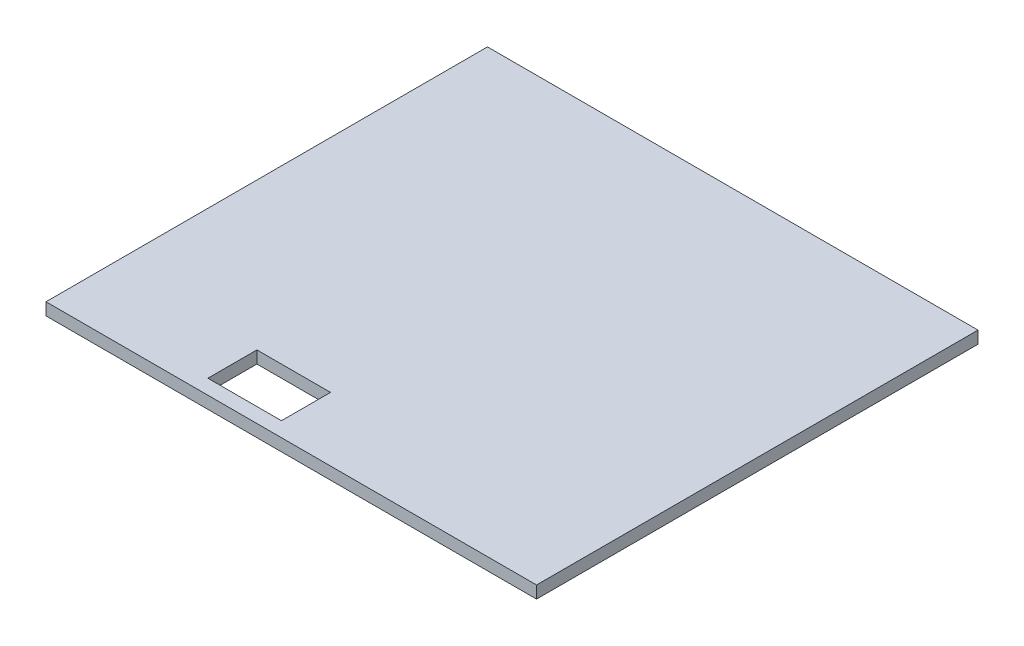
ISO-10303-21;
HEADER;
FILE_DESCRIPTION(('STEP AP214'),'2;1');
FILE_NAME('part.step','',(''),(''),'','','');
FILE_SCHEMA(('AUTOMOTIVE_DESIGN { 1 0 10303 214 1 1 1 1 }'));
ENDSEC;
DATA;
#1=APPLICATION_CONTEXT('core data for automotive mechanical design processes');
#2=APPLICATION_PROTOCOL_DEFINITION('international standard','automotive_design',2000,#1);
#3=PRODUCT_CONTEXT('',#1,'mechanical');
#4=PRODUCT('Part','Part','',(#3));
#5=PRODUCT_RELATED_PRODUCT_CATEGORY('part','',(#4));
#6=PRODUCT_DEFINITION_FORMATION('','',#4);
#7=PRODUCT_DEFINITION_CONTEXT('part definition',#1,'design');
#8=PRODUCT_DEFINITION('design','',#6,#7);
#9=PRODUCT_DEFINITION_SHAPE('','',#8);
#10=(LENGTH_UNIT() NAMED_UNIT(*) SI_UNIT(.MILLI.,.METRE.));
#11=(NAMED_UNIT(*) PLANE_ANGLE_UNIT() SI_UNIT($,.RADIAN.));
#12=(NAMED_UNIT(*) SI_UNIT($,.STERADIAN.) SOLID_ANGLE_UNIT());
#13=UNCERTAINTY_MEASURE_WITH_UNIT(LENGTH_MEASURE(1.E-05),#10,'distance_accuracy_value','');
#14=(GEOMETRIC_REPRESENTATION_CONTEXT(3) GLOBAL_UNCERTAINTY_ASSIGNED_CONTEXT((#13)) GLOBAL_UNIT_ASSIGNED_CONTEXT((#10,
#11,#12)) REPRESENTATION_CONTEXT('',''));
#15=CARTESIAN_POINT('',(0.,0.,0.));
#16=DIRECTION('',(0.,0.,1.));
#17=DIRECTION('',(1.,0.,0.));
#18=AXIS2_PLACEMENT_3D('',#15,#16,#17);
#19=CARTESIAN_POINT('',(0.,2.5,0.));
#20=DIRECTION('',(0.,1.,0.));
#21=DIRECTION('',(0.,0.,1.));
#22=AXIS2_PLACEMENT_3D('',#19,#20,#21);
#23=PLANE('',#22);
#24=DIRECTION('',(0.,0.,1.));
#25=VECTOR('',#24,1.);
#26=CARTESIAN_POINT('',(-50.,2.5,45.));
#27=LINE('',#26,#25);
#28=CARTESIAN_POINT('',(-50.,2.5,-45.));
#29=VERTEX_POINT('',#28);
#30=CARTESIAN_POINT('',(-50.,2.5,45.));
#31=VERTEX_POINT('',#30);
#32=EDGE_CURVE('E138',#29,#31,#27,.T.);
#33=ORIENTED_EDGE('',*,*,#32,.T.);
#34=DIRECTION('',(1.,0.,0.));
#35=VECTOR('',#34,1.);
#36=CARTESIAN_POINT('',(50.,2.5,45.));
#37=LINE('',#36,#35);
#38=CARTESIAN_POINT('',(50.,2.5,45.));
#39=VERTEX_POINT('',#38);
#40=EDGE_CURVE('E141',#31,#39,#37,.T.);
#41=ORIENTED_EDGE('',*,*,#40,.T.);
#42=DIRECTION('',(0.,0.,-1.));
#43=VECTOR('',#42,1.);
#44=CARTESIAN_POINT('',(50.,2.5,45.));
#45=LINE('',#44,#43);
#46=CARTESIAN_POINT('',(50.,2.5,-45.));
#47=VERTEX_POINT('',#46);
#48=EDGE_CURVE('E144',#39,#47,#45,.T.);
#49=ORIENTED_EDGE('',*,*,#48,.T.);
#50=DIRECTION('',(-1.,0.,0.));
#51=VECTOR('',#50,1.);
#52=CARTESIAN_POINT('',(50.,2.5,-45.));
#53=LINE('',#52,#51);
#54=EDGE_CURVE('E146',#47,#29,#53,.T.);
#55=ORIENTED_EDGE('',*,*,#54,.T.);
#56=EDGE_LOOP('',(#33,#41,#49,#55));
#57=FACE_BOUND('',#56,.T.);
#58=DIRECTION('',(-1.,0.,0.));
#59=VECTOR('',#58,1.);
#60=CARTESIAN_POINT('',(-20.,2.5,32.));
#61=LINE('',#60,#59);
#62=CARTESIAN_POINT('',(-5.,2.5,32.));
#63=VERTEX_POINT('',#62);
#64=CARTESIAN_POINT('',(-20.,2.5,32.));
#65=VERTEX_POINT('',#64);
#66=EDGE_CURVE('E110',#63,#65,#61,.T.);
#67=ORIENTED_EDGE('',*,*,#66,.F.);
#68=DIRECTION('',(0.,0.,-1.));
#69=VECTOR('',#68,1.);
#70=CARTESIAN_POINT('',(-5.,2.5,32.));
#71=LINE('',#70,#69);
#72=CARTESIAN_POINT('',(-5.,2.5,42.));
#73=VERTEX_POINT('',#72);
#74=EDGE_CURVE('E102',#73,#63,#71,.T.);
#75=ORIENTED_EDGE('',*,*,#74,.F.);
#76=DIRECTION('',(1.,0.,0.));
#77=VECTOR('',#76,1.);
#78=CARTESIAN_POINT('',(-20.,2.5,42.));
#79=LINE('',#78,#77);
#80=CARTESIAN_POINT('',(-20.,2.5,42.));
#81=VERTEX_POINT('',#80);
#82=EDGE_CURVE('E124',#81,#73,#79,.T.);
#83=ORIENTED_EDGE('',*,*,#82,.F.);
#84=DIRECTION('',(0.,0.,1.));
#85=VECTOR('',#84,1.);
#86=CARTESIAN_POINT('',(-20.,2.5,32.));
#87=LINE('',#86,#85);
#88=EDGE_CURVE('E122',#65,#81,#87,.T.);
#89=ORIENTED_EDGE('',*,*,#88,.F.);
#90=EDGE_LOOP('',(#67,#75,#83,#89));
#91=FACE_BOUND('',#90,.T.);
#92=ADVANCED_FACE('F37',(#57,#91),#23,.T.);
#93=CARTESIAN_POINT('',(0.,0.,0.));
#94=DIRECTION('',(0.,1.,0.));
#95=DIRECTION('',(0.,0.,1.));
#96=AXIS2_PLACEMENT_3D('',#93,#94,#95);
#97=PLANE('',#96);
#98=DIRECTION('',(0.,0.,1.));
#99=VECTOR('',#98,1.);
#100=CARTESIAN_POINT('',(-50.,0.,45.));
#101=LINE('',#100,#99);
#102=CARTESIAN_POINT('',(-50.,0.,-45.));
#103=VERTEX_POINT('',#102);
#104=CARTESIAN_POINT('',(-50.,0.,45.));
#105=VERTEX_POINT('',#104);
#106=EDGE_CURVE('E118',#103,#105,#101,.T.);
#107=ORIENTED_EDGE('',*,*,#106,.F.);
#108=DIRECTION('',(-1.,0.,0.));
#109=VECTOR('',#108,1.);
#110=CARTESIAN_POINT('',(50.,0.,-45.));
#111=LINE('',#110,#109);
#112=CARTESIAN_POINT('',(50.,0.,-45.));
#113=VERTEX_POINT('',#112);
#114=EDGE_CURVE('E142',#113,#103,#111,.T.);
#115=ORIENTED_EDGE('',*,*,#114,.F.);
#116=DIRECTION('',(0.,0.,-1.));
#117=VECTOR('',#116,1.);
#118=CARTESIAN_POINT('',(50.,0.,45.));
#119=LINE('',#118,#117);
#120=CARTESIAN_POINT('',(50.,0.,45.));
#121=VERTEX_POINT('',#120);
#122=EDGE_CURVE('E153',#121,#113,#119,.T.);
#123=ORIENTED_EDGE('',*,*,#122,.F.);
#124=DIRECTION('',(1.,0.,0.));
#125=VECTOR('',#124,1.);
#126=CARTESIAN_POINT('',(50.,0.,45.));
#127=LINE('',#126,#125);
#128=EDGE_CURVE('E151',#105,#121,#127,.T.);
#129=ORIENTED_EDGE('',*,*,#128,.F.);
#130=EDGE_LOOP('',(#107,#115,#123,#129));
#131=FACE_BOUND('',#130,.T.);
#132=DIRECTION('',(0.,0.,-1.));
#133=VECTOR('',#132,1.);
#134=CARTESIAN_POINT('',(-5.,0.,32.));
#135=LINE('',#134,#133);
#136=CARTESIAN_POINT('',(-5.,0.,42.));
#137=VERTEX_POINT('',#136);
#138=CARTESIAN_POINT('',(-5.,0.,32.));
#139=VERTEX_POINT('',#138);
#140=EDGE_CURVE('E60',#137,#139,#135,.T.);
#141=ORIENTED_EDGE('',*,*,#140,.T.);
#142=DIRECTION('',(-1.,0.,0.));
#143=VECTOR('',#142,1.);
#144=CARTESIAN_POINT('',(-20.,0.,32.));
#145=LINE('',#144,#143);
#146=CARTESIAN_POINT('',(-20.,0.,32.));
#147=VERTEX_POINT('',#146);
#148=EDGE_CURVE('E117',#139,#147,#145,.T.);
#149=ORIENTED_EDGE('',*,*,#148,.T.);
#150=DIRECTION('',(0.,0.,1.));
#151=VECTOR('',#150,1.);
#152=CARTESIAN_POINT('',(-20.,0.,32.));
#153=LINE('',#152,#151);
#154=CARTESIAN_POINT('',(-20.,0.,42.));
#155=VERTEX_POINT('',#154);
#156=EDGE_CURVE('E130',#147,#155,#153,.T.);
#157=ORIENTED_EDGE('',*,*,#156,.T.);
#158=DIRECTION('',(1.,0.,0.));
#159=VECTOR('',#158,1.);
#160=CARTESIAN_POINT('',(-20.,0.,42.));
#161=LINE('',#160,#159);
#162=EDGE_CURVE('E111',#155,#137,#161,.T.);
#163=ORIENTED_EDGE('',*,*,#162,.T.);
#164=EDGE_LOOP('',(#141,#149,#157,#163));
#165=FACE_BOUND('',#164,.T.);
#166=ADVANCED_FACE('F171',(#131,#165),#97,.F.);
#167=CARTESIAN_POINT('',(-50.,2.5,45.));
#168=DIRECTION('',(1.,0.,0.));
#169=DIRECTION('',(0.,0.,-1.));
#170=AXIS2_PLACEMENT_3D('',#167,#168,#169);
#171=PLANE('',#170);
#172=ORIENTED_EDGE('',*,*,#106,.T.);
#173=DIRECTION('',(0.,-1.,0.));
#174=VECTOR('',#173,1.);
#175=CARTESIAN_POINT('',(-50.,2.5,45.));
#176=LINE('',#175,#174);
#177=EDGE_CURVE('E11',#31,#105,#176,.T.);
#178=ORIENTED_EDGE('',*,*,#177,.F.);
#179=ORIENTED_EDGE('',*,*,#32,.F.);
#180=DIRECTION('',(0.,-1.,0.));
#181=VECTOR('',#180,1.);
#182=CARTESIAN_POINT('',(-50.,2.5,-45.));
#183=LINE('',#182,#181);
#184=EDGE_CURVE('E148',#29,#103,#183,.T.);
#185=ORIENTED_EDGE('',*,*,#184,.T.);
#186=EDGE_LOOP('',(#172,#178,#179,#185));
#187=FACE_BOUND('',#186,.T.);
#188=ADVANCED_FACE('F39',(#187),#171,.F.);
#189=CARTESIAN_POINT('',(50.,2.5,45.));
#190=DIRECTION('',(0.,0.,-1.));
#191=DIRECTION('',(-1.,0.,0.));
#192=AXIS2_PLACEMENT_3D('',#189,#190,#191);
#193=PLANE('',#192);
#194=ORIENTED_EDGE('',*,*,#128,.T.);
#195=DIRECTION('',(0.,-1.,0.));
#196=VECTOR('',#195,1.);
#197=CARTESIAN_POINT('',(50.,2.5,45.));
#198=LINE('',#197,#196);
#199=EDGE_CURVE('E45',#39,#121,#198,.T.);
#200=ORIENTED_EDGE('',*,*,#199,.F.);
#201=ORIENTED_EDGE('',*,*,#40,.F.);
#202=ORIENTED_EDGE('',*,*,#177,.T.);
#203=EDGE_LOOP('',(#194,#200,#201,#202));
#204=FACE_BOUND('',#203,.T.);
#205=ADVANCED_FACE('F181',(#204),#193,.F.);
#206=CARTESIAN_POINT('',(50.,2.5,45.));
#207=DIRECTION('',(-1.,0.,0.));
#208=DIRECTION('',(0.,0.,1.));
#209=AXIS2_PLACEMENT_3D('',#206,#207,#208);
#210=PLANE('',#209);
#211=ORIENTED_EDGE('',*,*,#122,.T.);
#212=DIRECTION('',(0.,-1.,0.));
#213=VECTOR('',#212,1.);
#214=CARTESIAN_POINT('',(50.,2.5,-45.));
#215=LINE('',#214,#213);
#216=EDGE_CURVE('E158',#47,#113,#215,.T.);
#217=ORIENTED_EDGE('',*,*,#216,.F.);
#218=ORIENTED_EDGE('',*,*,#48,.F.);
#219=ORIENTED_EDGE('',*,*,#199,.T.);
#220=EDGE_LOOP('',(#211,#217,#218,#219));
#221=FACE_BOUND('',#220,.T.);
#222=ADVANCED_FACE('F165',(#221),#210,.F.);
#223=CARTESIAN_POINT('',(50.,2.5,-45.));
#224=DIRECTION('',(0.,0.,1.));
#225=DIRECTION('',(1.,0.,0.));
#226=AXIS2_PLACEMENT_3D('',#223,#224,#225);
#227=PLANE('',#226);
#228=ORIENTED_EDGE('',*,*,#114,.T.);
#229=ORIENTED_EDGE('',*,*,#184,.F.);
#230=ORIENTED_EDGE('',*,*,#54,.F.);
#231=ORIENTED_EDGE('',*,*,#216,.T.);
#232=EDGE_LOOP('',(#228,#229,#230,#231));
#233=FACE_BOUND('',#232,.T.);
#234=ADVANCED_FACE('F175',(#233),#227,.F.);
#235=CARTESIAN_POINT('',(-5.,2.5,32.));
#236=DIRECTION('',(-1.,0.,0.));
#237=DIRECTION('',(0.,0.,1.));
#238=AXIS2_PLACEMENT_3D('',#235,#236,#237);
#239=PLANE('',#238);
#240=ORIENTED_EDGE('',*,*,#140,.F.);
#241=DIRECTION('',(0.,-1.,0.));
#242=VECTOR('',#241,1.);
#243=CARTESIAN_POINT('',(-5.,2.5,42.));
#244=LINE('',#243,#242);
#245=EDGE_CURVE('E106',#73,#137,#244,.T.);
#246=ORIENTED_EDGE('',*,*,#245,.F.);
#247=ORIENTED_EDGE('',*,*,#74,.T.);
#248=DIRECTION('',(0.,-1.,0.));
#249=VECTOR('',#248,1.);
#250=CARTESIAN_POINT('',(-5.,2.5,32.));
#251=LINE('',#250,#249);
#252=EDGE_CURVE('E105',#63,#139,#251,.T.);
#253=ORIENTED_EDGE('',*,*,#252,.T.);
#254=EDGE_LOOP('',(#240,#246,#247,#253));
#255=FACE_BOUND('',#254,.T.);
#256=ADVANCED_FACE('F104',(#255),#239,.T.);
#257=CARTESIAN_POINT('',(-20.,2.5,32.));
#258=DIRECTION('',(0.,0.,1.));
#259=DIRECTION('',(1.,0.,0.));
#260=AXIS2_PLACEMENT_3D('',#257,#258,#259);
#261=PLANE('',#260);
#262=ORIENTED_EDGE('',*,*,#148,.F.);
#263=ORIENTED_EDGE('',*,*,#252,.F.);
#264=ORIENTED_EDGE('',*,*,#66,.T.);
#265=DIRECTION('',(0.,-1.,0.));
#266=VECTOR('',#265,1.);
#267=CARTESIAN_POINT('',(-20.,2.5,32.));
#268=LINE('',#267,#266);
#269=EDGE_CURVE('E119',#65,#147,#268,.T.);
#270=ORIENTED_EDGE('',*,*,#269,.T.);
#271=EDGE_LOOP('',(#262,#263,#264,#270));
#272=FACE_BOUND('',#271,.T.);
#273=ADVANCED_FACE('F114',(#272),#261,.T.);
#274=CARTESIAN_POINT('',(-20.,2.5,32.));
#275=DIRECTION('',(1.,0.,0.));
#276=DIRECTION('',(0.,0.,-1.));
#277=AXIS2_PLACEMENT_3D('',#274,#275,#276);
#278=PLANE('',#277);
#279=ORIENTED_EDGE('',*,*,#156,.F.);
#280=ORIENTED_EDGE('',*,*,#269,.F.);
#281=ORIENTED_EDGE('',*,*,#88,.T.);
#282=DIRECTION('',(0.,-1.,0.));
#283=VECTOR('',#282,1.);
#284=CARTESIAN_POINT('',(-20.,2.5,42.));
#285=LINE('',#284,#283);
#286=EDGE_CURVE('E52',#81,#155,#285,.T.);
#287=ORIENTED_EDGE('',*,*,#286,.T.);
#288=EDGE_LOOP('',(#279,#280,#281,#287));
#289=FACE_BOUND('',#288,.T.);
#290=ADVANCED_FACE('F204',(#289),#278,.T.);
#291=CARTESIAN_POINT('',(-20.,2.5,42.));
#292=DIRECTION('',(0.,0.,-1.));
#293=DIRECTION('',(-1.,0.,0.));
#294=AXIS2_PLACEMENT_3D('',#291,#292,#293);
#295=PLANE('',#294);
#296=ORIENTED_EDGE('',*,*,#162,.F.);
#297=ORIENTED_EDGE('',*,*,#286,.F.);
#298=ORIENTED_EDGE('',*,*,#82,.T.);
#299=ORIENTED_EDGE('',*,*,#245,.T.);
#300=EDGE_LOOP('',(#296,#297,#298,#299));
#301=FACE_BOUND('',#300,.T.);
#302=ADVANCED_FACE('F208',(#301),#295,.T.);
#303=CLOSED_SHELL('',(#92,#166,#188,#205,#222,#234,#256,#273,#290,#302));
#304=MANIFOLD_SOLID_BREP('B2',#303);
#305=ADVANCED_BREP_SHAPE_REPRESENTATION('',(#18,#304),#14);
#306=SHAPE_DEFINITION_REPRESENTATION(#9,#305);
ENDSEC;
END-ISO-10303-21;
